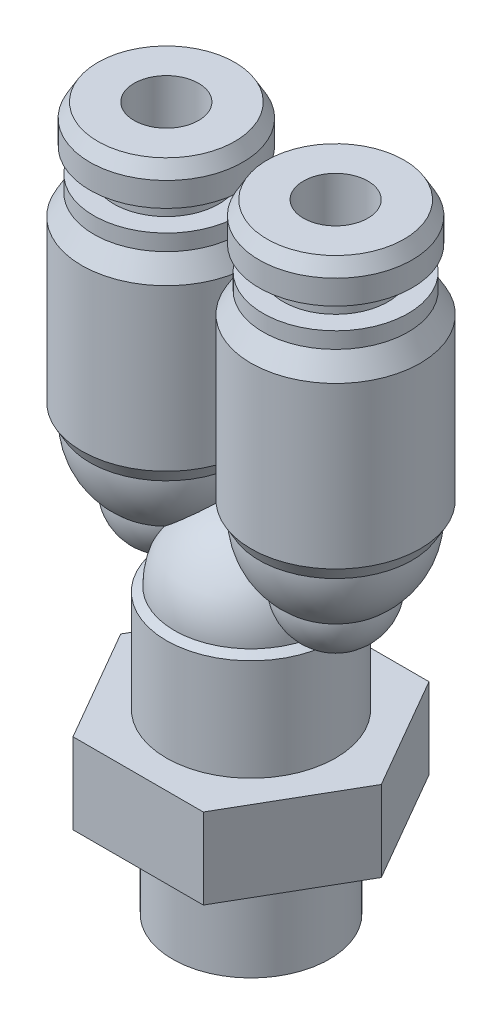
ISO-10303-21;
HEADER;
FILE_DESCRIPTION(('STEP AP214'),'2;1');
FILE_NAME('part.step','',(''),(''),'','','');
FILE_SCHEMA(('AUTOMOTIVE_DESIGN { 1 0 10303 214 1 1 1 1 }'));
ENDSEC;
DATA;
#1=APPLICATION_CONTEXT('core data for automotive mechanical design processes');
#2=APPLICATION_PROTOCOL_DEFINITION('international standard','automotive_design',2000,#1);
#3=PRODUCT_CONTEXT('',#1,'mechanical');
#4=PRODUCT('Part','Part','',(#3));
#5=PRODUCT_RELATED_PRODUCT_CATEGORY('part','',(#4));
#6=PRODUCT_DEFINITION_FORMATION('','',#4);
#7=PRODUCT_DEFINITION_CONTEXT('part definition',#1,'design');
#8=PRODUCT_DEFINITION('design','',#6,#7);
#9=PRODUCT_DEFINITION_SHAPE('','',#8);
#10=(LENGTH_UNIT() NAMED_UNIT(*) SI_UNIT(.MILLI.,.METRE.));
#11=(NAMED_UNIT(*) PLANE_ANGLE_UNIT() SI_UNIT($,.RADIAN.));
#12=(NAMED_UNIT(*) SI_UNIT($,.STERADIAN.) SOLID_ANGLE_UNIT());
#13=UNCERTAINTY_MEASURE_WITH_UNIT(LENGTH_MEASURE(1.E-05),#10,'distance_accuracy_value','');
#14=(GEOMETRIC_REPRESENTATION_CONTEXT(3) GLOBAL_UNCERTAINTY_ASSIGNED_CONTEXT((#13)) GLOBAL_UNIT_ASSIGNED_CONTEXT((#10,
#11,#12)) REPRESENTATION_CONTEXT('',''));
#15=CARTESIAN_POINT('',(0.,0.,0.));
#16=DIRECTION('',(0.,0.,1.));
#17=DIRECTION('',(1.,0.,0.));
#18=AXIS2_PLACEMENT_3D('',#15,#16,#17);
#19=CARTESIAN_POINT('',(9.,-18.,0.));
#20=DIRECTION('',(0.,1.,0.));
#21=DIRECTION('',(-1.,0.,0.));
#22=AXIS2_PLACEMENT_3D('',#19,#20,#21);
#23=PLANE('',#22);
#24=CARTESIAN_POINT('',(0.,-18.,0.));
#25=DIRECTION('',(0.,1.,0.));
#26=DIRECTION('',(-1.,0.,0.));
#27=AXIS2_PLACEMENT_3D('',#24,#25,#26);
#28=CIRCLE('',#27,4.86399999999998);
#29=CARTESIAN_POINT('',(-4.86399999999997,-18.,0.));
#30=VERTEX_POINT('',#29);
#31=EDGE_CURVE('P0_E24',#30,#30,#28,.T.);
#32=ORIENTED_EDGE('',*,*,#31,.T.);
#33=EDGE_LOOP('',(#32));
#34=FACE_BOUND('',#33,.T.);
#35=DIRECTION('',(0.5,0.,0.866025403784439));
#36=VECTOR('',#35,1.);
#37=CARTESIAN_POINT('',(4.04145188432728,-18.,-7.));
#38=LINE('',#37,#36);
#39=CARTESIAN_POINT('',(4.04145188432729,-18.,-7.));
#40=VERTEX_POINT('',#39);
#41=CARTESIAN_POINT('',(8.08290376865467,-18.,0.));
#42=VERTEX_POINT('',#41);
#43=EDGE_CURVE('P0_E31',#40,#42,#38,.T.);
#44=ORIENTED_EDGE('',*,*,#43,.T.);
#45=DIRECTION('',(-0.5,0.,0.866025403784439));
#46=VECTOR('',#45,1.);
#47=CARTESIAN_POINT('',(8.08290376865467,-18.,0.));
#48=LINE('',#47,#46);
#49=CARTESIAN_POINT('',(4.04145188432728,-18.,7.));
#50=VERTEX_POINT('',#49);
#51=EDGE_CURVE('P0_E79',#42,#50,#48,.T.);
#52=ORIENTED_EDGE('',*,*,#51,.T.);
#53=DIRECTION('',(-1.,0.,0.));
#54=VECTOR('',#53,1.);
#55=CARTESIAN_POINT('',(4.04145188432728,-18.,7.));
#56=LINE('',#55,#54);
#57=CARTESIAN_POINT('',(-4.04145188432748,-18.,7.));
#58=VERTEX_POINT('',#57);
#59=EDGE_CURVE('P0_E85',#50,#58,#56,.T.);
#60=ORIENTED_EDGE('',*,*,#59,.T.);
#61=DIRECTION('',(-0.5,0.,-0.866025403784439));
#62=VECTOR('',#61,1.);
#63=CARTESIAN_POINT('',(-4.04145188432748,-18.,7.));
#64=LINE('',#63,#62);
#65=CARTESIAN_POINT('',(-8.08290376865486,-18.,0.));
#66=VERTEX_POINT('',#65);
#67=EDGE_CURVE('P0_E95',#58,#66,#64,.T.);
#68=ORIENTED_EDGE('',*,*,#67,.T.);
#69=DIRECTION('',(0.5,0.,-0.866025403784439));
#70=VECTOR('',#69,1.);
#71=CARTESIAN_POINT('',(-8.08290376865486,-18.,0.));
#72=LINE('',#71,#70);
#73=CARTESIAN_POINT('',(-4.04145188432748,-18.,-7.));
#74=VERTEX_POINT('',#73);
#75=EDGE_CURVE('P0_E98',#66,#74,#72,.T.);
#76=ORIENTED_EDGE('',*,*,#75,.T.);
#77=DIRECTION('',(1.,0.,0.));
#78=VECTOR('',#77,1.);
#79=CARTESIAN_POINT('',(-4.04145188432748,-18.,-7.));
#80=LINE('',#79,#78);
#81=EDGE_CURVE('P0_E89',#74,#40,#80,.T.);
#82=ORIENTED_EDGE('',*,*,#81,.T.);
#83=EDGE_LOOP('',(#44,#52,#60,#68,#76,#82));
#84=FACE_BOUND('',#83,.T.);
#85=ADVANCED_FACE('P0_F16',(#34,#84),#23,.F.);
#86=CARTESIAN_POINT('',(0.,-24.,0.));
#87=DIRECTION('',(0.,1.,0.));
#88=DIRECTION('',(-1.,0.,0.));
#89=AXIS2_PLACEMENT_3D('',#86,#87,#88);
#90=PLANE('',#89);
#91=CARTESIAN_POINT('',(0.,-24.,0.));
#92=DIRECTION('',(0.,-1.,0.));
#93=DIRECTION('',(1.,0.,0.));
#94=AXIS2_PLACEMENT_3D('',#91,#92,#93);
#95=CIRCLE('',#94,1.49999999999988);
#96=CARTESIAN_POINT('',(1.49999999999986,-24.,0.));
#97=VERTEX_POINT('',#96);
#98=EDGE_CURVE('P0_E113',#97,#97,#95,.T.);
#99=ORIENTED_EDGE('',*,*,#98,.F.);
#100=EDGE_LOOP('',(#99));
#101=FACE_BOUND('',#100,.T.);
#102=CARTESIAN_POINT('',(0.,-24.,0.));
#103=DIRECTION('',(0.,1.,0.));
#104=DIRECTION('',(-1.,0.,0.));
#105=AXIS2_PLACEMENT_3D('',#102,#103,#104);
#106=CIRCLE('',#105,4.864);
#107=CARTESIAN_POINT('',(-4.864,-24.,0.));
#108=VERTEX_POINT('',#107);
#109=EDGE_CURVE('P0_E11',#108,#108,#106,.T.);
#110=ORIENTED_EDGE('',*,*,#109,.F.);
#111=EDGE_LOOP('',(#110));
#112=FACE_BOUND('',#111,.T.);
#113=ADVANCED_FACE('P0_F18',(#101,#112),#90,.F.);
#114=CARTESIAN_POINT('',(0.,-24.,0.));
#115=DIRECTION('',(0.,1.,0.));
#116=DIRECTION('',(-1.,0.,0.));
#117=AXIS2_PLACEMENT_3D('',#114,#115,#116);
#118=CYLINDRICAL_SURFACE('',#117,4.86399999999999);
#119=ORIENTED_EDGE('',*,*,#31,.F.);
#120=EDGE_LOOP('',(#119));
#121=FACE_BOUND('',#120,.T.);
#122=ORIENTED_EDGE('',*,*,#109,.T.);
#123=EDGE_LOOP('',(#122));
#124=FACE_BOUND('',#123,.T.);
#125=ADVANCED_FACE('P0_F128',(#121,#124),#118,.T.);
#126=CARTESIAN_POINT('',(0.,-6.99999999999999,0.));
#127=DIRECTION('',(0.,-1.,0.));
#128=DIRECTION('',(1.,0.,0.));
#129=AXIS2_PLACEMENT_3D('',#126,#127,#128);
#130=CYLINDRICAL_SURFACE('',#129,1.49999999999988);
#131=CARTESIAN_POINT('',(0.,-6.99999999999999,0.));
#132=DIRECTION('',(0.,-1.,0.));
#133=DIRECTION('',(1.,0.,0.));
#134=AXIS2_PLACEMENT_3D('',#131,#132,#133);
#135=CIRCLE('',#134,1.49999999999988);
#136=CARTESIAN_POINT('',(1.49999999999987,-6.99999999999999,0.));
#137=VERTEX_POINT('',#136);
#138=EDGE_CURVE('P0_E109',#137,#137,#135,.T.);
#139=ORIENTED_EDGE('',*,*,#138,.F.);
#140=EDGE_LOOP('',(#139));
#141=FACE_BOUND('',#140,.T.);
#142=ORIENTED_EDGE('',*,*,#98,.T.);
#143=EDGE_LOOP('',(#142));
#144=FACE_BOUND('',#143,.T.);
#145=ADVANCED_FACE('P0_F131',(#141,#144),#130,.F.);
#146=CARTESIAN_POINT('',(0.,-6.99999999999999,0.));
#147=DIRECTION('',(0.,-1.,0.));
#148=DIRECTION('',(1.,0.,0.));
#149=AXIS2_PLACEMENT_3D('',#146,#147,#148);
#150=PLANE('',#149);
#151=ORIENTED_EDGE('',*,*,#138,.T.);
#152=EDGE_LOOP('',(#151));
#153=FACE_BOUND('',#152,.T.);
#154=ADVANCED_FACE('P0_F144',(#153),#150,.T.);
#155=CARTESIAN_POINT('',(4.04145188432731,14.9352197055975,-7.));
#156=DIRECTION('',(0.866025403784439,0.,-0.5));
#157=DIRECTION('',(-0.5,0.,-0.866025403784439));
#158=AXIS2_PLACEMENT_3D('',#155,#156,#157);
#159=PLANE('',#158);
#160=DIRECTION('',(0.,-1.,0.));
#161=VECTOR('',#160,1.);
#162=CARTESIAN_POINT('',(8.08290376865469,14.9352197055975,0.));
#163=LINE('',#162,#161);
#164=CARTESIAN_POINT('',(8.08290376865467,-13.,0.));
#165=VERTEX_POINT('',#164);
#166=EDGE_CURVE('P0_E68',#165,#42,#163,.T.);
#167=ORIENTED_EDGE('',*,*,#166,.T.);
#168=ORIENTED_EDGE('',*,*,#43,.F.);
#169=DIRECTION('',(0.,-1.,0.));
#170=VECTOR('',#169,1.);
#171=CARTESIAN_POINT('',(4.04145188432731,14.9352197055975,-7.));
#172=LINE('',#171,#170);
#173=CARTESIAN_POINT('',(4.04145188432729,-13.,-7.));
#174=VERTEX_POINT('',#173);
#175=EDGE_CURVE('P0_E76',#174,#40,#172,.T.);
#176=ORIENTED_EDGE('',*,*,#175,.F.);
#177=DIRECTION('',(-0.5,0.,-0.866025403784439));
#178=VECTOR('',#177,1.);
#179=CARTESIAN_POINT('',(4.04145188432728,-13.,-7.00000000000002));
#180=LINE('',#179,#178);
#181=EDGE_CURVE('P0_E72',#165,#174,#180,.T.);
#182=ORIENTED_EDGE('',*,*,#181,.F.);
#183=EDGE_LOOP('',(#167,#168,#176,#182));
#184=FACE_BOUND('',#183,.T.);
#185=ADVANCED_FACE('P0_F70',(#184),#159,.T.);
#186=CARTESIAN_POINT('',(8.08290376865469,14.9352197055975,0.));
#187=DIRECTION('',(0.866025403784438,0.,0.5));
#188=DIRECTION('',(0.5,0.,-0.866025403784439));
#189=AXIS2_PLACEMENT_3D('',#186,#187,#188);
#190=PLANE('',#189);
#191=DIRECTION('',(0.,-1.,0.));
#192=VECTOR('',#191,1.);
#193=CARTESIAN_POINT('',(4.04145188432731,14.9352197055975,7.));
#194=LINE('',#193,#192);
#195=CARTESIAN_POINT('',(4.04145188432729,-13.,7.));
#196=VERTEX_POINT('',#195);
#197=EDGE_CURVE('P0_E75',#196,#50,#194,.T.);
#198=ORIENTED_EDGE('',*,*,#197,.T.);
#199=ORIENTED_EDGE('',*,*,#51,.F.);
#200=ORIENTED_EDGE('',*,*,#166,.F.);
#201=DIRECTION('',(0.5,0.,-0.866025403784439));
#202=VECTOR('',#201,1.);
#203=CARTESIAN_POINT('',(8.08290376865466,-13.,0.));
#204=LINE('',#203,#202);
#205=EDGE_CURVE('P0_E116',#196,#165,#204,.T.);
#206=ORIENTED_EDGE('',*,*,#205,.F.);
#207=EDGE_LOOP('',(#198,#199,#200,#206));
#208=FACE_BOUND('',#207,.T.);
#209=ADVANCED_FACE('P0_F80',(#208),#190,.T.);
#210=CARTESIAN_POINT('',(4.04145188432731,14.9352197055975,7.));
#211=DIRECTION('',(0.,0.,1.));
#212=DIRECTION('',(1.,0.,0.));
#213=AXIS2_PLACEMENT_3D('',#210,#211,#212);
#214=PLANE('',#213);
#215=DIRECTION('',(0.,-1.,0.));
#216=VECTOR('',#215,1.);
#217=CARTESIAN_POINT('',(-4.04145188432745,14.9352197055975,7.));
#218=LINE('',#217,#216);
#219=CARTESIAN_POINT('',(-4.04145188432748,-13.,7.));
#220=VERTEX_POINT('',#219);
#221=EDGE_CURVE('P0_E103',#220,#58,#218,.T.);
#222=ORIENTED_EDGE('',*,*,#221,.T.);
#223=ORIENTED_EDGE('',*,*,#59,.F.);
#224=ORIENTED_EDGE('',*,*,#197,.F.);
#225=DIRECTION('',(1.,0.,0.));
#226=VECTOR('',#225,1.);
#227=CARTESIAN_POINT('',(4.04145188432725,-13.,7.));
#228=LINE('',#227,#226);
#229=EDGE_CURVE('P0_E179',#220,#196,#228,.T.);
#230=ORIENTED_EDGE('',*,*,#229,.F.);
#231=EDGE_LOOP('',(#222,#223,#224,#230));
#232=FACE_BOUND('',#231,.T.);
#233=ADVANCED_FACE('P0_F195',(#232),#214,.T.);
#234=CARTESIAN_POINT('',(-4.04145188432745,14.9352197055975,7.));
#235=DIRECTION('',(-0.866025403784439,0.,0.5));
#236=DIRECTION('',(0.5,0.,0.866025403784439));
#237=AXIS2_PLACEMENT_3D('',#234,#235,#236);
#238=PLANE('',#237);
#239=DIRECTION('',(0.,-1.,0.));
#240=VECTOR('',#239,1.);
#241=CARTESIAN_POINT('',(-8.08290376865483,14.9352197055975,0.));
#242=LINE('',#241,#240);
#243=CARTESIAN_POINT('',(-8.08290376865485,-13.,0.));
#244=VERTEX_POINT('',#243);
#245=EDGE_CURVE('P0_E101',#244,#66,#242,.T.);
#246=ORIENTED_EDGE('',*,*,#245,.T.);
#247=ORIENTED_EDGE('',*,*,#67,.F.);
#248=ORIENTED_EDGE('',*,*,#221,.F.);
#249=DIRECTION('',(0.5,0.,0.866025403784439));
#250=VECTOR('',#249,1.);
#251=CARTESIAN_POINT('',(-4.04145188432748,-13.,6.99999999999998));
#252=LINE('',#251,#250);
#253=EDGE_CURVE('P0_E181',#244,#220,#252,.T.);
#254=ORIENTED_EDGE('',*,*,#253,.F.);
#255=EDGE_LOOP('',(#246,#247,#248,#254));
#256=FACE_BOUND('',#255,.T.);
#257=ADVANCED_FACE('P0_F192',(#256),#238,.T.);
#258=CARTESIAN_POINT('',(-8.08290376865483,14.9352197055975,0.));
#259=DIRECTION('',(-0.866025403784439,0.,-0.5));
#260=DIRECTION('',(-0.5,0.,0.866025403784439));
#261=AXIS2_PLACEMENT_3D('',#258,#259,#260);
#262=PLANE('',#261);
#263=DIRECTION('',(0.,-1.,0.));
#264=VECTOR('',#263,1.);
#265=CARTESIAN_POINT('',(-4.04145188432745,14.9352197055975,-7.));
#266=LINE('',#265,#264);
#267=CARTESIAN_POINT('',(-4.04145188432748,-13.,-7.));
#268=VERTEX_POINT('',#267);
#269=EDGE_CURVE('P0_E39',#268,#74,#266,.T.);
#270=ORIENTED_EDGE('',*,*,#269,.T.);
#271=ORIENTED_EDGE('',*,*,#75,.F.);
#272=ORIENTED_EDGE('',*,*,#245,.F.);
#273=DIRECTION('',(-0.5,0.,0.866025403784439));
#274=VECTOR('',#273,1.);
#275=CARTESIAN_POINT('',(-8.08290376865486,-13.,0.));
#276=LINE('',#275,#274);
#277=EDGE_CURVE('P0_E185',#268,#244,#276,.T.);
#278=ORIENTED_EDGE('',*,*,#277,.F.);
#279=EDGE_LOOP('',(#270,#271,#272,#278));
#280=FACE_BOUND('',#279,.T.);
#281=ADVANCED_FACE('P0_F188',(#280),#262,.T.);
#282=CARTESIAN_POINT('',(-4.04145188432745,14.9352197055975,-7.));
#283=DIRECTION('',(0.,0.,-1.));
#284=DIRECTION('',(-1.,0.,0.));
#285=AXIS2_PLACEMENT_3D('',#282,#283,#284);
#286=PLANE('',#285);
#287=ORIENTED_EDGE('',*,*,#175,.T.);
#288=ORIENTED_EDGE('',*,*,#81,.F.);
#289=ORIENTED_EDGE('',*,*,#269,.F.);
#290=DIRECTION('',(-1.,0.,0.));
#291=VECTOR('',#290,1.);
#292=CARTESIAN_POINT('',(-4.04145188432751,-13.,-7.));
#293=LINE('',#292,#291);
#294=EDGE_CURVE('P0_E108',#174,#268,#293,.T.);
#295=ORIENTED_EDGE('',*,*,#294,.F.);
#296=EDGE_LOOP('',(#287,#288,#289,#295));
#297=FACE_BOUND('',#296,.T.);
#298=ADVANCED_FACE('P0_F159',(#297),#286,.T.);
#299=CARTESIAN_POINT('',(0.,-6.4,0.));
#300=DIRECTION('',(0.,1.,0.));
#301=DIRECTION('',(1.,0.,0.));
#302=AXIS2_PLACEMENT_3D('',#299,#300,#301);
#303=SPHERICAL_SURFACE('',#302,4.75);
#304=CARTESIAN_POINT('',(0.,-6.39999999999999,0.));
#305=DIRECTION('',(0.,1.,0.));
#306=DIRECTION('',(-1.,0.,0.));
#307=AXIS2_PLACEMENT_3D('',#304,#305,#306);
#308=CIRCLE('',#307,4.74999999999996);
#309=CARTESIAN_POINT('',(-4.74999999999991,-6.39999999999998,0.));
#310=VERTEX_POINT('',#309);
#311=EDGE_CURVE('P0_E112',#310,#310,#308,.T.);
#312=ORIENTED_EDGE('',*,*,#311,.T.);
#313=EDGE_LOOP('',(#312));
#314=FACE_BOUND('',#313,.T.);
#315=ADVANCED_FACE('P0_F155',(#314),#303,.T.);
#316=CARTESIAN_POINT('',(0.,-6.6886751345948,0.));
#317=DIRECTION('',(0.,-1.,0.));
#318=DIRECTION('',(1.,0.,0.));
#319=AXIS2_PLACEMENT_3D('',#316,#317,#318);
#320=CONICAL_SURFACE('',#319,5.24999999999996,1.0471975511966);
#321=ORIENTED_EDGE('',*,*,#311,.F.);
#322=EDGE_LOOP('',(#321));
#323=FACE_BOUND('',#322,.T.);
#324=CARTESIAN_POINT('',(0.,-6.6886751345948,0.));
#325=DIRECTION('',(0.,1.,0.));
#326=DIRECTION('',(-1.,0.,0.));
#327=AXIS2_PLACEMENT_3D('',#324,#325,#326);
#328=CIRCLE('',#327,5.24999999999996);
#329=CARTESIAN_POINT('',(-5.24999999999991,-6.68867513459479,0.));
#330=VERTEX_POINT('',#329);
#331=EDGE_CURVE('P0_E119',#330,#330,#328,.T.);
#332=ORIENTED_EDGE('',*,*,#331,.T.);
#333=EDGE_LOOP('',(#332));
#334=FACE_BOUND('',#333,.T.);
#335=ADVANCED_FACE('P0_F158',(#323,#334),#320,.T.);
#336=CARTESIAN_POINT('',(0.,-24.,0.));
#337=DIRECTION('',(0.,1.,0.));
#338=DIRECTION('',(-1.,0.,0.));
#339=AXIS2_PLACEMENT_3D('',#336,#337,#338);
#340=CYLINDRICAL_SURFACE('',#339,5.24999999999996);
#341=ORIENTED_EDGE('',*,*,#331,.F.);
#342=EDGE_LOOP('',(#341));
#343=FACE_BOUND('',#342,.T.);
#344=CARTESIAN_POINT('',(0.,-13.,0.));
#345=DIRECTION('',(0.,1.,0.));
#346=DIRECTION('',(-1.,0.,0.));
#347=AXIS2_PLACEMENT_3D('',#344,#345,#346);
#348=CIRCLE('',#347,5.24999999999997);
#349=CARTESIAN_POINT('',(-5.24999999999994,-13.,0.));
#350=VERTEX_POINT('',#349);
#351=EDGE_CURVE('P0_E122',#350,#350,#348,.T.);
#352=ORIENTED_EDGE('',*,*,#351,.T.);
#353=EDGE_LOOP('',(#352));
#354=FACE_BOUND('',#353,.T.);
#355=ADVANCED_FACE('P0_F163',(#343,#354),#340,.T.);
#356=CARTESIAN_POINT('',(5.25,-13.,0.));
#357=DIRECTION('',(0.,-1.,0.));
#358=DIRECTION('',(1.,0.,0.));
#359=AXIS2_PLACEMENT_3D('',#356,#357,#358);
#360=PLANE('',#359);
#361=ORIENTED_EDGE('',*,*,#351,.F.);
#362=EDGE_LOOP('',(#361));
#363=FACE_BOUND('',#362,.T.);
#364=ORIENTED_EDGE('',*,*,#181,.T.);
#365=ORIENTED_EDGE('',*,*,#294,.T.);
#366=ORIENTED_EDGE('',*,*,#277,.T.);
#367=ORIENTED_EDGE('',*,*,#253,.T.);
#368=ORIENTED_EDGE('',*,*,#229,.T.);
#369=ORIENTED_EDGE('',*,*,#205,.T.);
#370=EDGE_LOOP('',(#364,#365,#366,#367,#368,#369));
#371=FACE_BOUND('',#370,.T.);
#372=ADVANCED_FACE('P0_F167',(#363,#371),#360,.F.);
#373=CLOSED_SHELL('',(#85,#113,#125,#145,#154,#185,#209,#233,#257,#281,#298,#315,#335,#355,#372));
#374=MANIFOLD_SOLID_BREP('P0_B1',#373);
#375=CARTESIAN_POINT('',(5.25,17.,0.));
#376=DIRECTION('',(0.,1.,0.));
#377=DIRECTION('',(0.,0.,1.));
#378=AXIS2_PLACEMENT_3D('',#375,#376,#377);
#379=PLANE('',#378);
#380=CARTESIAN_POINT('',(5.25,17.,0.));
#381=DIRECTION('',(0.,1.,0.));
#382=DIRECTION('',(0.,0.,1.));
#383=AXIS2_PLACEMENT_3D('',#380,#381,#382);
#384=CIRCLE('',#383,2.);
#385=CARTESIAN_POINT('',(5.25,17.,2.));
#386=VERTEX_POINT('',#385);
#387=EDGE_CURVE('P1_E55',#386,#386,#384,.T.);
#388=ORIENTED_EDGE('',*,*,#387,.F.);
#389=EDGE_LOOP('',(#388));
#390=FACE_BOUND('',#389,.T.);
#391=CARTESIAN_POINT('',(5.25,17.,0.));
#392=DIRECTION('',(0.,-1.,0.));
#393=DIRECTION('',(0.,0.,-1.));
#394=AXIS2_PLACEMENT_3D('',#391,#392,#393);
#395=CIRCLE('',#394,4.25);
#396=CARTESIAN_POINT('',(5.25,17.,-4.25));
#397=VERTEX_POINT('',#396);
#398=EDGE_CURVE('P1_E10',#397,#397,#395,.T.);
#399=ORIENTED_EDGE('',*,*,#398,.F.);
#400=EDGE_LOOP('',(#399));
#401=FACE_BOUND('',#400,.T.);
#402=ADVANCED_FACE('P1_F14',(#390,#401),#379,.T.);
#403=CARTESIAN_POINT('',(5.25,16.1339745962156,0.));
#404=DIRECTION('',(0.,-1.,0.));
#405=DIRECTION('',(0.,0.,-1.));
#406=AXIS2_PLACEMENT_3D('',#403,#404,#405);
#407=CONICAL_SURFACE('',#406,4.75,0.523598775598301);
#408=ORIENTED_EDGE('',*,*,#398,.T.);
#409=EDGE_LOOP('',(#408));
#410=FACE_BOUND('',#409,.T.);
#411=CARTESIAN_POINT('',(5.25,16.1339745962156,0.));
#412=DIRECTION('',(0.,-1.,0.));
#413=DIRECTION('',(0.,0.,-1.));
#414=AXIS2_PLACEMENT_3D('',#411,#412,#413);
#415=CIRCLE('',#414,4.75);
#416=CARTESIAN_POINT('',(5.25,16.1339745962156,-4.75));
#417=VERTEX_POINT('',#416);
#418=EDGE_CURVE('P1_E20',#417,#417,#415,.T.);
#419=ORIENTED_EDGE('',*,*,#418,.F.);
#420=EDGE_LOOP('',(#419));
#421=FACE_BOUND('',#420,.T.);
#422=ADVANCED_FACE('P1_F72',(#410,#421),#407,.T.);
#423=CARTESIAN_POINT('',(5.25,17.,0.));
#424=DIRECTION('',(0.,-1.,0.));
#425=DIRECTION('',(0.,0.,-1.));
#426=AXIS2_PLACEMENT_3D('',#423,#424,#425);
#427=CYLINDRICAL_SURFACE('',#426,4.75);
#428=ORIENTED_EDGE('',*,*,#418,.T.);
#429=EDGE_LOOP('',(#428));
#430=FACE_BOUND('',#429,.T.);
#431=CARTESIAN_POINT('',(5.25,14.6339745962156,0.));
#432=DIRECTION('',(0.,-1.,0.));
#433=DIRECTION('',(0.,0.,-1.));
#434=AXIS2_PLACEMENT_3D('',#431,#432,#433);
#435=CIRCLE('',#434,4.75);
#436=CARTESIAN_POINT('',(5.25,14.6339745962156,-4.75));
#437=VERTEX_POINT('',#436);
#438=EDGE_CURVE('P1_E24',#437,#437,#435,.T.);
#439=ORIENTED_EDGE('',*,*,#438,.F.);
#440=EDGE_LOOP('',(#439));
#441=FACE_BOUND('',#440,.T.);
#442=ADVANCED_FACE('P1_F77',(#430,#441),#427,.T.);
#443=CARTESIAN_POINT('',(10.,14.6339745962156,0.));
#444=DIRECTION('',(0.,-1.,0.));
#445=DIRECTION('',(0.,0.,-1.));
#446=AXIS2_PLACEMENT_3D('',#443,#444,#445);
#447=PLANE('',#446);
#448=ORIENTED_EDGE('',*,*,#438,.T.);
#449=EDGE_LOOP('',(#448));
#450=FACE_BOUND('',#449,.T.);
#451=CARTESIAN_POINT('',(5.25,14.6339745962156,0.));
#452=DIRECTION('',(0.,-1.,0.));
#453=DIRECTION('',(0.,0.,-1.));
#454=AXIS2_PLACEMENT_3D('',#451,#452,#453);
#455=CIRCLE('',#454,3.25);
#456=CARTESIAN_POINT('',(5.25,14.6339745962156,-3.25));
#457=VERTEX_POINT('',#456);
#458=EDGE_CURVE('P1_E28',#457,#457,#455,.T.);
#459=ORIENTED_EDGE('',*,*,#458,.F.);
#460=EDGE_LOOP('',(#459));
#461=FACE_BOUND('',#460,.T.);
#462=ADVANCED_FACE('P1_F81',(#450,#461),#447,.T.);
#463=CARTESIAN_POINT('',(5.25,17.,0.));
#464=DIRECTION('',(0.,-1.,0.));
#465=DIRECTION('',(0.,0.,-1.));
#466=AXIS2_PLACEMENT_3D('',#463,#464,#465);
#467=CYLINDRICAL_SURFACE('',#466,3.24999999999999);
#468=ORIENTED_EDGE('',*,*,#458,.T.);
#469=EDGE_LOOP('',(#468));
#470=FACE_BOUND('',#469,.T.);
#471=CARTESIAN_POINT('',(5.25,13.1339745962156,0.));
#472=DIRECTION('',(0.,-1.,0.));
#473=DIRECTION('',(0.,0.,-1.));
#474=AXIS2_PLACEMENT_3D('',#471,#472,#473);
#475=CIRCLE('',#474,3.24999999999999);
#476=CARTESIAN_POINT('',(5.25,13.1339745962156,-3.24999999999999));
#477=VERTEX_POINT('',#476);
#478=EDGE_CURVE('P1_E33',#477,#477,#475,.T.);
#479=ORIENTED_EDGE('',*,*,#478,.F.);
#480=EDGE_LOOP('',(#479));
#481=FACE_BOUND('',#480,.T.);
#482=ADVANCED_FACE('P1_F87',(#470,#481),#467,.T.);
#483=CARTESIAN_POINT('',(8.49999999999999,13.1339745962156,0.));
#484=DIRECTION('',(0.,1.,0.));
#485=DIRECTION('',(0.,0.,1.));
#486=AXIS2_PLACEMENT_3D('',#483,#484,#485);
#487=PLANE('',#486);
#488=ORIENTED_EDGE('',*,*,#478,.T.);
#489=EDGE_LOOP('',(#488));
#490=FACE_BOUND('',#489,.T.);
#491=CARTESIAN_POINT('',(5.25,13.1339745962156,0.));
#492=DIRECTION('',(0.,-1.,0.));
#493=DIRECTION('',(0.,0.,-1.));
#494=AXIS2_PLACEMENT_3D('',#491,#492,#493);
#495=CIRCLE('',#494,4.5);
#496=CARTESIAN_POINT('',(5.25,13.1339745962156,-4.5));
#497=VERTEX_POINT('',#496);
#498=EDGE_CURVE('P1_E36',#497,#497,#495,.T.);
#499=ORIENTED_EDGE('',*,*,#498,.F.);
#500=EDGE_LOOP('',(#499));
#501=FACE_BOUND('',#500,.T.);
#502=ADVANCED_FACE('P1_F91',(#490,#501),#487,.T.);
#503=CARTESIAN_POINT('',(5.25,17.,0.));
#504=DIRECTION('',(0.,-1.,0.));
#505=DIRECTION('',(0.,0.,-1.));
#506=AXIS2_PLACEMENT_3D('',#503,#504,#505);
#507=CYLINDRICAL_SURFACE('',#506,4.5);
#508=ORIENTED_EDGE('',*,*,#498,.T.);
#509=EDGE_LOOP('',(#508));
#510=FACE_BOUND('',#509,.T.);
#511=CARTESIAN_POINT('',(5.25,12.1339745962156,0.));
#512=DIRECTION('',(0.,-1.,0.));
#513=DIRECTION('',(0.,0.,-1.));
#514=AXIS2_PLACEMENT_3D('',#511,#512,#513);
#515=CIRCLE('',#514,4.5);
#516=CARTESIAN_POINT('',(5.25,12.1339745962156,-4.5));
#517=VERTEX_POINT('',#516);
#518=EDGE_CURVE('P1_E39',#517,#517,#515,.T.);
#519=ORIENTED_EDGE('',*,*,#518,.F.);
#520=EDGE_LOOP('',(#519));
#521=FACE_BOUND('',#520,.T.);
#522=ADVANCED_FACE('P1_F95',(#510,#521),#507,.T.);
#523=CARTESIAN_POINT('',(5.25,10.8349364905389,0.));
#524=DIRECTION('',(0.,-1.,0.));
#525=DIRECTION('',(0.,0.,-1.));
#526=AXIS2_PLACEMENT_3D('',#523,#524,#525);
#527=CONICAL_SURFACE('',#526,5.25,0.523598775598299);
#528=ORIENTED_EDGE('',*,*,#518,.T.);
#529=EDGE_LOOP('',(#528));
#530=FACE_BOUND('',#529,.T.);
#531=CARTESIAN_POINT('',(5.25,10.8349364905389,0.));
#532=DIRECTION('',(0.,-1.,0.));
#533=DIRECTION('',(0.,0.,-1.));
#534=AXIS2_PLACEMENT_3D('',#531,#532,#533);
#535=CIRCLE('',#534,5.25);
#536=CARTESIAN_POINT('',(5.25,10.8349364905389,-5.25));
#537=VERTEX_POINT('',#536);
#538=EDGE_CURVE('P1_E42',#537,#537,#535,.T.);
#539=ORIENTED_EDGE('',*,*,#538,.F.);
#540=EDGE_LOOP('',(#539));
#541=FACE_BOUND('',#540,.T.);
#542=ADVANCED_FACE('P1_F99',(#530,#541),#527,.T.);
#543=CARTESIAN_POINT('',(5.25,17.,0.));
#544=DIRECTION('',(0.,-1.,0.));
#545=DIRECTION('',(0.,0.,-1.));
#546=AXIS2_PLACEMENT_3D('',#543,#544,#545);
#547=CYLINDRICAL_SURFACE('',#546,5.25);
#548=ORIENTED_EDGE('',*,*,#538,.T.);
#549=EDGE_LOOP('',(#548));
#550=FACE_BOUND('',#549,.T.);
#551=CARTESIAN_POINT('',(5.25,0.866025403784439,0.));
#552=DIRECTION('',(0.,-1.,0.));
#553=DIRECTION('',(0.,0.,-1.));
#554=AXIS2_PLACEMENT_3D('',#551,#552,#553);
#555=CIRCLE('',#554,5.25);
#556=CARTESIAN_POINT('',(5.25,0.866025403784439,-5.25));
#557=VERTEX_POINT('',#556);
#558=EDGE_CURVE('P1_E45',#557,#557,#555,.T.);
#559=ORIENTED_EDGE('',*,*,#558,.F.);
#560=EDGE_LOOP('',(#559));
#561=FACE_BOUND('',#560,.T.);
#562=ADVANCED_FACE('P1_F103',(#550,#561),#547,.T.);
#563=CARTESIAN_POINT('',(5.25,0.,0.));
#564=DIRECTION('',(0.,1.,0.));
#565=DIRECTION('',(0.,0.,1.));
#566=AXIS2_PLACEMENT_3D('',#563,#564,#565);
#567=CONICAL_SURFACE('',#566,4.75,0.5235987755983);
#568=ORIENTED_EDGE('',*,*,#558,.T.);
#569=EDGE_LOOP('',(#568));
#570=FACE_BOUND('',#569,.T.);
#571=CARTESIAN_POINT('',(5.25,0.,0.));
#572=DIRECTION('',(0.,-1.,0.));
#573=DIRECTION('',(0.,0.,-1.));
#574=AXIS2_PLACEMENT_3D('',#571,#572,#573);
#575=CIRCLE('',#574,4.75);
#576=CARTESIAN_POINT('',(5.25,0.,-4.75));
#577=VERTEX_POINT('',#576);
#578=EDGE_CURVE('P1_E48',#577,#577,#575,.T.);
#579=ORIENTED_EDGE('',*,*,#578,.F.);
#580=EDGE_LOOP('',(#579));
#581=FACE_BOUND('',#580,.T.);
#582=ADVANCED_FACE('P1_F107',(#570,#581),#567,.T.);
#583=CARTESIAN_POINT('',(5.25,0.,0.));
#584=DIRECTION('',(0.,-1.,0.));
#585=DIRECTION('',(1.,0.,0.));
#586=AXIS2_PLACEMENT_3D('',#583,#584,#585);
#587=SPHERICAL_SURFACE('',#586,4.75);
#588=ORIENTED_EDGE('',*,*,#578,.T.);
#589=EDGE_LOOP('',(#588));
#590=FACE_BOUND('',#589,.T.);
#591=CARTESIAN_POINT('',(5.25,-3.6552334276159,0.));
#592=DIRECTION('',(0.,-1.,0.));
#593=DIRECTION('',(0.,0.,-1.));
#594=AXIS2_PLACEMENT_3D('',#591,#592,#593);
#595=CIRCLE('',#594,3.03344170697894);
#596=CARTESIAN_POINT('',(5.25,-3.6552334276159,-3.03344170697894));
#597=VERTEX_POINT('',#596);
#598=EDGE_CURVE('P1_E51',#597,#597,#595,.T.);
#599=ORIENTED_EDGE('',*,*,#598,.F.);
#600=EDGE_LOOP('',(#599));
#601=FACE_BOUND('',#600,.T.);
#602=ADVANCED_FACE('P1_F111',(#590,#601),#587,.T.);
#603=CARTESIAN_POINT('',(5.25,-3.6552334276159,0.));
#604=DIRECTION('',(0.,-1.,0.));
#605=DIRECTION('',(1.,0.,0.));
#606=AXIS2_PLACEMENT_3D('',#603,#604,#605);
#607=SPHERICAL_SURFACE('',#606,3.03344170697894);
#608=ORIENTED_EDGE('',*,*,#598,.T.);
#609=EDGE_LOOP('',(#608));
#610=FACE_BOUND('',#609,.T.);
#611=ADVANCED_FACE('P1_F66',(#610),#607,.T.);
#612=CARTESIAN_POINT('',(5.25,0.,0.));
#613=DIRECTION('',(0.,1.,0.));
#614=DIRECTION('',(0.,0.,1.));
#615=AXIS2_PLACEMENT_3D('',#612,#613,#614);
#616=CYLINDRICAL_SURFACE('',#615,2.);
#617=CARTESIAN_POINT('',(5.25,0.,0.));
#618=DIRECTION('',(0.,1.,0.));
#619=DIRECTION('',(0.,0.,1.));
#620=AXIS2_PLACEMENT_3D('',#617,#618,#619);
#621=CIRCLE('',#620,2.);
#622=CARTESIAN_POINT('',(5.25,0.,2.));
#623=VERTEX_POINT('',#622);
#624=EDGE_CURVE('P1_E54',#623,#623,#621,.T.);
#625=ORIENTED_EDGE('',*,*,#624,.F.);
#626=EDGE_LOOP('',(#625));
#627=FACE_BOUND('',#626,.T.);
#628=ORIENTED_EDGE('',*,*,#387,.T.);
#629=EDGE_LOOP('',(#628));
#630=FACE_BOUND('',#629,.T.);
#631=ADVANCED_FACE('P1_F63',(#627,#630),#616,.F.);
#632=CARTESIAN_POINT('',(5.25,0.,0.));
#633=DIRECTION('',(0.,1.,0.));
#634=DIRECTION('',(0.,0.,1.));
#635=AXIS2_PLACEMENT_3D('',#632,#633,#634);
#636=PLANE('',#635);
#637=ORIENTED_EDGE('',*,*,#624,.T.);
#638=EDGE_LOOP('',(#637));
#639=FACE_BOUND('',#638,.T.);
#640=ADVANCED_FACE('P1_F61',(#639),#636,.T.);
#641=CLOSED_SHELL('',(#402,#422,#442,#462,#482,#502,#522,#542,#562,#582,#602,#611,#631,#640));
#642=MANIFOLD_SOLID_BREP('P1_B1',#641);
#643=CARTESIAN_POINT('',(-5.25,-3.6552334276159,0.));
#644=DIRECTION('',(0.,1.,0.));
#645=DIRECTION('',(-1.,0.,0.));
#646=AXIS2_PLACEMENT_3D('',#643,#644,#645);
#647=SPHERICAL_SURFACE('',#646,3.03344170697894);
#648=CARTESIAN_POINT('',(-5.25,-3.6552334276159,0.));
#649=DIRECTION('',(0.,1.,0.));
#650=DIRECTION('',(-1.,0.,0.));
#651=AXIS2_PLACEMENT_3D('',#648,#649,#650);
#652=CIRCLE('',#651,3.03344170697894);
#653=CARTESIAN_POINT('',(-8.28344170697894,-3.6552334276159,0.));
#654=VERTEX_POINT('',#653);
#655=EDGE_CURVE('P2_E10',#654,#654,#652,.T.);
#656=ORIENTED_EDGE('',*,*,#655,.F.);
#657=EDGE_LOOP('',(#656));
#658=FACE_BOUND('',#657,.T.);
#659=ADVANCED_FACE('P2_F14',(#658),#647,.T.);
#660=CARTESIAN_POINT('',(-5.25,0.,0.));
#661=DIRECTION('',(0.,1.,0.));
#662=DIRECTION('',(-1.,0.,0.));
#663=AXIS2_PLACEMENT_3D('',#660,#661,#662);
#664=SPHERICAL_SURFACE('',#663,4.75);
#665=ORIENTED_EDGE('',*,*,#655,.T.);
#666=EDGE_LOOP('',(#665));
#667=FACE_BOUND('',#666,.T.);
#668=CARTESIAN_POINT('',(-5.25,0.,0.));
#669=DIRECTION('',(0.,1.,0.));
#670=DIRECTION('',(-1.,0.,0.));
#671=AXIS2_PLACEMENT_3D('',#668,#669,#670);
#672=CIRCLE('',#671,4.75);
#673=CARTESIAN_POINT('',(-10.,0.,0.));
#674=VERTEX_POINT('',#673);
#675=EDGE_CURVE('P2_E20',#674,#674,#672,.T.);
#676=ORIENTED_EDGE('',*,*,#675,.F.);
#677=EDGE_LOOP('',(#676));
#678=FACE_BOUND('',#677,.T.);
#679=ADVANCED_FACE('P2_F88',(#667,#678),#664,.T.);
#680=CARTESIAN_POINT('',(-5.25,0.866025403784439,0.));
#681=DIRECTION('',(0.,1.,0.));
#682=DIRECTION('',(-1.,0.,0.));
#683=AXIS2_PLACEMENT_3D('',#680,#681,#682);
#684=CONICAL_SURFACE('',#683,5.25,0.5235987755983);
#685=ORIENTED_EDGE('',*,*,#675,.T.);
#686=EDGE_LOOP('',(#685));
#687=FACE_BOUND('',#686,.T.);
#688=CARTESIAN_POINT('',(-5.25,0.866025403784439,0.));
#689=DIRECTION('',(0.,1.,0.));
#690=DIRECTION('',(-1.,0.,0.));
#691=AXIS2_PLACEMENT_3D('',#688,#689,#690);
#692=CIRCLE('',#691,5.25);
#693=CARTESIAN_POINT('',(-10.5,0.866025403784439,0.));
#694=VERTEX_POINT('',#693);
#695=EDGE_CURVE('P2_E24',#694,#694,#692,.T.);
#696=ORIENTED_EDGE('',*,*,#695,.F.);
#697=EDGE_LOOP('',(#696));
#698=FACE_BOUND('',#697,.T.);
#699=ADVANCED_FACE('P2_F93',(#687,#698),#684,.T.);
#700=CARTESIAN_POINT('',(-5.25,17.,0.));
#701=DIRECTION('',(0.,1.,0.));
#702=DIRECTION('',(-1.,0.,0.));
#703=AXIS2_PLACEMENT_3D('',#700,#701,#702);
#704=CYLINDRICAL_SURFACE('',#703,5.25);
#705=ORIENTED_EDGE('',*,*,#695,.T.);
#706=EDGE_LOOP('',(#705));
#707=FACE_BOUND('',#706,.T.);
#708=CARTESIAN_POINT('',(-5.25,10.8349364905389,0.));
#709=DIRECTION('',(0.,1.,0.));
#710=DIRECTION('',(-1.,0.,0.));
#711=AXIS2_PLACEMENT_3D('',#708,#709,#710);
#712=CIRCLE('',#711,5.25);
#713=CARTESIAN_POINT('',(-10.5,10.8349364905389,0.));
#714=VERTEX_POINT('',#713);
#715=EDGE_CURVE('P2_E28',#714,#714,#712,.T.);
#716=ORIENTED_EDGE('',*,*,#715,.F.);
#717=EDGE_LOOP('',(#716));
#718=FACE_BOUND('',#717,.T.);
#719=ADVANCED_FACE('P2_F97',(#707,#718),#704,.T.);
#720=CARTESIAN_POINT('',(-5.25,12.1339745962156,0.));
#721=DIRECTION('',(0.,-1.,0.));
#722=DIRECTION('',(1.,0.,0.));
#723=AXIS2_PLACEMENT_3D('',#720,#721,#722);
#724=CONICAL_SURFACE('',#723,4.49999999999999,0.523598775598299);
#725=ORIENTED_EDGE('',*,*,#715,.T.);
#726=EDGE_LOOP('',(#725));
#727=FACE_BOUND('',#726,.T.);
#728=CARTESIAN_POINT('',(-5.25,12.1339745962156,0.));
#729=DIRECTION('',(0.,1.,0.));
#730=DIRECTION('',(-1.,0.,0.));
#731=AXIS2_PLACEMENT_3D('',#728,#729,#730);
#732=CIRCLE('',#731,4.49999999999999);
#733=CARTESIAN_POINT('',(-9.74999999999999,12.1339745962156,0.));
#734=VERTEX_POINT('',#733);
#735=EDGE_CURVE('P2_E33',#734,#734,#732,.T.);
#736=ORIENTED_EDGE('',*,*,#735,.F.);
#737=EDGE_LOOP('',(#736));
#738=FACE_BOUND('',#737,.T.);
#739=ADVANCED_FACE('P2_F103',(#727,#738),#724,.T.);
#740=CARTESIAN_POINT('',(-5.25,17.,0.));
#741=DIRECTION('',(0.,1.,0.));
#742=DIRECTION('',(-1.,0.,0.));
#743=AXIS2_PLACEMENT_3D('',#740,#741,#742);
#744=CYLINDRICAL_SURFACE('',#743,4.49999999999999);
#745=ORIENTED_EDGE('',*,*,#735,.T.);
#746=EDGE_LOOP('',(#745));
#747=FACE_BOUND('',#746,.T.);
#748=CARTESIAN_POINT('',(-5.25,13.1339745962156,0.));
#749=DIRECTION('',(0.,1.,0.));
#750=DIRECTION('',(-1.,0.,0.));
#751=AXIS2_PLACEMENT_3D('',#748,#749,#750);
#752=CIRCLE('',#751,4.5);
#753=CARTESIAN_POINT('',(-9.75,13.1339745962156,0.));
#754=VERTEX_POINT('',#753);
#755=EDGE_CURVE('P2_E36',#754,#754,#752,.T.);
#756=ORIENTED_EDGE('',*,*,#755,.F.);
#757=EDGE_LOOP('',(#756));
#758=FACE_BOUND('',#757,.T.);
#759=ADVANCED_FACE('P2_F107',(#747,#758),#744,.T.);
#760=CARTESIAN_POINT('',(-9.75,13.1339745962156,0.));
#761=DIRECTION('',(0.,1.,0.));
#762=DIRECTION('',(-1.,0.,0.));
#763=AXIS2_PLACEMENT_3D('',#760,#761,#762);
#764=PLANE('',#763);
#765=ORIENTED_EDGE('',*,*,#755,.T.);
#766=EDGE_LOOP('',(#765));
#767=FACE_BOUND('',#766,.T.);
#768=CARTESIAN_POINT('',(-5.25,13.1339745962156,0.));
#769=DIRECTION('',(0.,1.,0.));
#770=DIRECTION('',(-1.,0.,0.));
#771=AXIS2_PLACEMENT_3D('',#768,#769,#770);
#772=CIRCLE('',#771,3.24999999999999);
#773=CARTESIAN_POINT('',(-8.49999999999999,13.1339745962156,0.));
#774=VERTEX_POINT('',#773);
#775=EDGE_CURVE('P2_E39',#774,#774,#772,.T.);
#776=ORIENTED_EDGE('',*,*,#775,.F.);
#777=EDGE_LOOP('',(#776));
#778=FACE_BOUND('',#777,.T.);
#779=ADVANCED_FACE('P2_F111',(#767,#778),#764,.T.);
#780=CARTESIAN_POINT('',(-5.25,17.,0.));
#781=DIRECTION('',(0.,1.,0.));
#782=DIRECTION('',(-1.,0.,0.));
#783=AXIS2_PLACEMENT_3D('',#780,#781,#782);
#784=CYLINDRICAL_SURFACE('',#783,3.24999999999999);
#785=ORIENTED_EDGE('',*,*,#775,.T.);
#786=EDGE_LOOP('',(#785));
#787=FACE_BOUND('',#786,.T.);
#788=CARTESIAN_POINT('',(-5.25,14.6339745962156,0.));
#789=DIRECTION('',(0.,1.,0.));
#790=DIRECTION('',(-1.,0.,0.));
#791=AXIS2_PLACEMENT_3D('',#788,#789,#790);
#792=CIRCLE('',#791,3.24999999999999);
#793=CARTESIAN_POINT('',(-8.49999999999999,14.6339745962156,0.));
#794=VERTEX_POINT('',#793);
#795=EDGE_CURVE('P2_E42',#794,#794,#792,.T.);
#796=ORIENTED_EDGE('',*,*,#795,.F.);
#797=EDGE_LOOP('',(#796));
#798=FACE_BOUND('',#797,.T.);
#799=ADVANCED_FACE('P2_F115',(#787,#798),#784,.T.);
#800=CARTESIAN_POINT('',(-8.49999999999999,14.6339745962156,0.));
#801=DIRECTION('',(0.,-1.,0.));
#802=DIRECTION('',(1.,0.,0.));
#803=AXIS2_PLACEMENT_3D('',#800,#801,#802);
#804=PLANE('',#803);
#805=ORIENTED_EDGE('',*,*,#795,.T.);
#806=EDGE_LOOP('',(#805));
#807=FACE_BOUND('',#806,.T.);
#808=CARTESIAN_POINT('',(-5.25,14.6339745962156,0.));
#809=DIRECTION('',(0.,1.,0.));
#810=DIRECTION('',(-1.,0.,0.));
#811=AXIS2_PLACEMENT_3D('',#808,#809,#810);
#812=CIRCLE('',#811,4.75);
#813=CARTESIAN_POINT('',(-10.,14.6339745962156,0.));
#814=VERTEX_POINT('',#813);
#815=EDGE_CURVE('P2_E45',#814,#814,#812,.T.);
#816=ORIENTED_EDGE('',*,*,#815,.F.);
#817=EDGE_LOOP('',(#816));
#818=FACE_BOUND('',#817,.T.);
#819=ADVANCED_FACE('P2_F84',(#807,#818),#804,.T.);
#820=CARTESIAN_POINT('',(-5.25,17.,0.));
#821=DIRECTION('',(0.,1.,0.));
#822=DIRECTION('',(-1.,0.,0.));
#823=AXIS2_PLACEMENT_3D('',#820,#821,#822);
#824=CYLINDRICAL_SURFACE('',#823,4.75);
#825=ORIENTED_EDGE('',*,*,#815,.T.);
#826=EDGE_LOOP('',(#825));
#827=FACE_BOUND('',#826,.T.);
#828=CARTESIAN_POINT('',(-5.25,16.1339745962156,0.));
#829=DIRECTION('',(0.,1.,0.));
#830=DIRECTION('',(-1.,0.,0.));
#831=AXIS2_PLACEMENT_3D('',#828,#829,#830);
#832=CIRCLE('',#831,4.75);
#833=CARTESIAN_POINT('',(-10.,16.1339745962156,0.));
#834=VERTEX_POINT('',#833);
#835=EDGE_CURVE('P2_E48',#834,#834,#832,.T.);
#836=ORIENTED_EDGE('',*,*,#835,.F.);
#837=EDGE_LOOP('',(#836));
#838=FACE_BOUND('',#837,.T.);
#839=ADVANCED_FACE('P2_F77',(#827,#838),#824,.T.);
#840=CARTESIAN_POINT('',(-5.25,17.,0.));
#841=DIRECTION('',(0.,-1.,0.));
#842=DIRECTION('',(1.,0.,0.));
#843=AXIS2_PLACEMENT_3D('',#840,#841,#842);
#844=CONICAL_SURFACE('',#843,4.25,0.523598775598301);
#845=ORIENTED_EDGE('',*,*,#835,.T.);
#846=EDGE_LOOP('',(#845));
#847=FACE_BOUND('',#846,.T.);
#848=CARTESIAN_POINT('',(-5.25,17.,0.));
#849=DIRECTION('',(0.,1.,0.));
#850=DIRECTION('',(-1.,0.,0.));
#851=AXIS2_PLACEMENT_3D('',#848,#849,#850);
#852=CIRCLE('',#851,4.25);
#853=CARTESIAN_POINT('',(-9.5,17.,0.));
#854=VERTEX_POINT('',#853);
#855=EDGE_CURVE('P2_E51',#854,#854,#852,.T.);
#856=ORIENTED_EDGE('',*,*,#855,.F.);
#857=EDGE_LOOP('',(#856));
#858=FACE_BOUND('',#857,.T.);
#859=ADVANCED_FACE('P2_F72',(#847,#858),#844,.T.);
#860=CARTESIAN_POINT('',(-9.5,17.,0.));
#861=DIRECTION('',(0.,1.,0.));
#862=DIRECTION('',(-1.,0.,0.));
#863=AXIS2_PLACEMENT_3D('',#860,#861,#862);
#864=PLANE('',#863);
#865=CARTESIAN_POINT('',(-5.25,17.,0.));
#866=DIRECTION('',(0.,1.,0.));
#867=DIRECTION('',(-1.,0.,0.));
#868=AXIS2_PLACEMENT_3D('',#865,#866,#867);
#869=CIRCLE('',#868,2.);
#870=CARTESIAN_POINT('',(-7.25,17.,0.));
#871=VERTEX_POINT('',#870);
#872=EDGE_CURVE('P2_E55',#871,#871,#869,.T.);
#873=ORIENTED_EDGE('',*,*,#872,.F.);
#874=EDGE_LOOP('',(#873));
#875=FACE_BOUND('',#874,.T.);
#876=ORIENTED_EDGE('',*,*,#855,.T.);
#877=EDGE_LOOP('',(#876));
#878=FACE_BOUND('',#877,.T.);
#879=ADVANCED_FACE('P2_F66',(#875,#878),#864,.T.);
#880=CARTESIAN_POINT('',(-5.25,0.,0.));
#881=DIRECTION('',(0.,1.,0.));
#882=DIRECTION('',(-1.,0.,0.));
#883=AXIS2_PLACEMENT_3D('',#880,#881,#882);
#884=CYLINDRICAL_SURFACE('',#883,2.);
#885=CARTESIAN_POINT('',(-5.25,0.,0.));
#886=DIRECTION('',(0.,1.,0.));
#887=DIRECTION('',(-1.,0.,0.));
#888=AXIS2_PLACEMENT_3D('',#885,#886,#887);
#889=CIRCLE('',#888,2.);
#890=CARTESIAN_POINT('',(-7.25,0.,0.));
#891=VERTEX_POINT('',#890);
#892=EDGE_CURVE('P2_E54',#891,#891,#889,.T.);
#893=ORIENTED_EDGE('',*,*,#892,.F.);
#894=EDGE_LOOP('',(#893));
#895=FACE_BOUND('',#894,.T.);
#896=ORIENTED_EDGE('',*,*,#872,.T.);
#897=EDGE_LOOP('',(#896));
#898=FACE_BOUND('',#897,.T.);
#899=ADVANCED_FACE('P2_F63',(#895,#898),#884,.F.);
#900=CARTESIAN_POINT('',(-5.25,0.,0.));
#901=DIRECTION('',(0.,1.,0.));
#902=DIRECTION('',(-1.,0.,0.));
#903=AXIS2_PLACEMENT_3D('',#900,#901,#902);
#904=PLANE('',#903);
#905=ORIENTED_EDGE('',*,*,#892,.T.);
#906=EDGE_LOOP('',(#905));
#907=FACE_BOUND('',#906,.T.);
#908=ADVANCED_FACE('P2_F61',(#907),#904,.T.);
#909=CLOSED_SHELL('',(#659,#679,#699,#719,#739,#759,#779,#799,#819,#839,#859,#879,#899,#908));
#910=MANIFOLD_SOLID_BREP('P2_B1',#909);
#911=ADVANCED_BREP_SHAPE_REPRESENTATION('',(#18,#374,#642,#910),#14);
#912=SHAPE_DEFINITION_REPRESENTATION(#9,#911);
ENDSEC;
END-ISO-10303-21;
